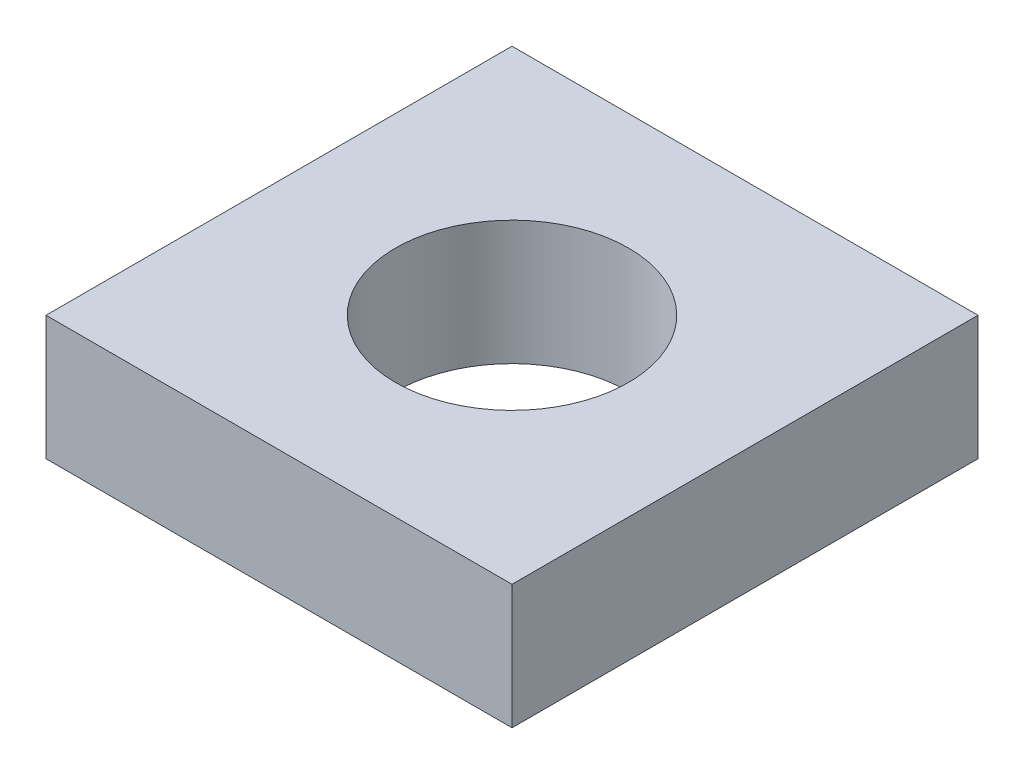
ISO-10303-21;
HEADER;
FILE_DESCRIPTION(('STEP AP214'),'2;1');
FILE_NAME('part.step','',(''),(''),'','','');
FILE_SCHEMA(('AUTOMOTIVE_DESIGN { 1 0 10303 214 1 1 1 1 }'));
ENDSEC;
DATA;
#1=APPLICATION_CONTEXT('core data for automotive mechanical design processes');
#2=APPLICATION_PROTOCOL_DEFINITION('international standard','automotive_design',2000,#1);
#3=PRODUCT_CONTEXT('',#1,'mechanical');
#4=PRODUCT('Part','Part','',(#3));
#5=PRODUCT_RELATED_PRODUCT_CATEGORY('part','',(#4));
#6=PRODUCT_DEFINITION_FORMATION('','',#4);
#7=PRODUCT_DEFINITION_CONTEXT('part definition',#1,'design');
#8=PRODUCT_DEFINITION('design','',#6,#7);
#9=PRODUCT_DEFINITION_SHAPE('','',#8);
#10=(LENGTH_UNIT() NAMED_UNIT(*) SI_UNIT(.MILLI.,.METRE.));
#11=(NAMED_UNIT(*) PLANE_ANGLE_UNIT() SI_UNIT($,.RADIAN.));
#12=(NAMED_UNIT(*) SI_UNIT($,.STERADIAN.) SOLID_ANGLE_UNIT());
#13=UNCERTAINTY_MEASURE_WITH_UNIT(LENGTH_MEASURE(1.E-05),#10,'distance_accuracy_value','');
#14=(GEOMETRIC_REPRESENTATION_CONTEXT(3) GLOBAL_UNCERTAINTY_ASSIGNED_CONTEXT((#13)) GLOBAL_UNIT_ASSIGNED_CONTEXT((#10,
#11,#12)) REPRESENTATION_CONTEXT('',''));
#15=CARTESIAN_POINT('',(0.,0.,0.));
#16=DIRECTION('',(0.,0.,1.));
#17=DIRECTION('',(1.,0.,0.));
#18=AXIS2_PLACEMENT_3D('',#15,#16,#17);
#19=CARTESIAN_POINT('',(0.,1.6,0.));
#20=DIRECTION('',(0.,1.,0.));
#21=DIRECTION('',(0.,0.,1.));
#22=AXIS2_PLACEMENT_3D('',#19,#20,#21);
#23=PLANE('',#22);
#24=DIRECTION('',(0.,0.,-1.));
#25=VECTOR('',#24,1.);
#26=CARTESIAN_POINT('',(3.,1.6,-3.));
#27=LINE('',#26,#25);
#28=CARTESIAN_POINT('',(3.,1.6,3.));
#29=VERTEX_POINT('',#28);
#30=CARTESIAN_POINT('',(3.,1.6,-3.));
#31=VERTEX_POINT('',#30);
#32=EDGE_CURVE('E85',#29,#31,#27,.T.);
#33=ORIENTED_EDGE('',*,*,#32,.T.);
#34=DIRECTION('',(-1.,0.,0.));
#35=VECTOR('',#34,1.);
#36=CARTESIAN_POINT('',(-3.,1.6,-3.));
#37=LINE('',#36,#35);
#38=CARTESIAN_POINT('',(-3.,1.6,-3.));
#39=VERTEX_POINT('',#38);
#40=EDGE_CURVE('E80',#31,#39,#37,.T.);
#41=ORIENTED_EDGE('',*,*,#40,.T.);
#42=DIRECTION('',(0.,0.,1.));
#43=VECTOR('',#42,1.);
#44=CARTESIAN_POINT('',(-3.,1.6,-3.));
#45=LINE('',#44,#43);
#46=CARTESIAN_POINT('',(-3.,1.6,3.));
#47=VERTEX_POINT('',#46);
#48=EDGE_CURVE('E83',#39,#47,#45,.T.);
#49=ORIENTED_EDGE('',*,*,#48,.T.);
#50=DIRECTION('',(1.,0.,0.));
#51=VECTOR('',#50,1.);
#52=CARTESIAN_POINT('',(-3.,1.6,3.));
#53=LINE('',#52,#51);
#54=EDGE_CURVE('E50',#47,#29,#53,.T.);
#55=ORIENTED_EDGE('',*,*,#54,.T.);
#56=EDGE_LOOP('',(#33,#41,#49,#55));
#57=FACE_BOUND('',#56,.T.);
#58=CARTESIAN_POINT('',(0.,1.6,0.));
#59=DIRECTION('',(0.,1.,0.));
#60=DIRECTION('',(0.,0.,1.));
#61=AXIS2_PLACEMENT_3D('',#58,#59,#60);
#62=CIRCLE('',#61,1.5);
#63=CARTESIAN_POINT('',(0.,1.6,1.5));
#64=VERTEX_POINT('',#63);
#65=EDGE_CURVE('E100',#64,#64,#62,.T.);
#66=ORIENTED_EDGE('',*,*,#65,.F.);
#67=EDGE_LOOP('',(#66));
#68=FACE_BOUND('',#67,.T.);
#69=ADVANCED_FACE('F33',(#57,#68),#23,.T.);
#70=CARTESIAN_POINT('',(0.,0.,0.));
#71=DIRECTION('',(0.,1.,0.));
#72=DIRECTION('',(0.,0.,1.));
#73=AXIS2_PLACEMENT_3D('',#70,#71,#72);
#74=PLANE('',#73);
#75=DIRECTION('',(0.,0.,-1.));
#76=VECTOR('',#75,1.);
#77=CARTESIAN_POINT('',(3.,0.,-3.));
#78=LINE('',#77,#76);
#79=CARTESIAN_POINT('',(3.,0.,3.));
#80=VERTEX_POINT('',#79);
#81=CARTESIAN_POINT('',(3.,0.,-3.));
#82=VERTEX_POINT('',#81);
#83=EDGE_CURVE('E97',#80,#82,#78,.T.);
#84=ORIENTED_EDGE('',*,*,#83,.F.);
#85=DIRECTION('',(1.,0.,0.));
#86=VECTOR('',#85,1.);
#87=CARTESIAN_POINT('',(-3.,0.,3.));
#88=LINE('',#87,#86);
#89=CARTESIAN_POINT('',(-3.,0.,3.));
#90=VERTEX_POINT('',#89);
#91=EDGE_CURVE('E73',#90,#80,#88,.T.);
#92=ORIENTED_EDGE('',*,*,#91,.F.);
#93=DIRECTION('',(0.,0.,1.));
#94=VECTOR('',#93,1.);
#95=CARTESIAN_POINT('',(-3.,0.,-3.));
#96=LINE('',#95,#94);
#97=CARTESIAN_POINT('',(-3.,0.,-3.));
#98=VERTEX_POINT('',#97);
#99=EDGE_CURVE('E67',#98,#90,#96,.T.);
#100=ORIENTED_EDGE('',*,*,#99,.F.);
#101=DIRECTION('',(-1.,0.,0.));
#102=VECTOR('',#101,1.);
#103=CARTESIAN_POINT('',(-3.,0.,-3.));
#104=LINE('',#103,#102);
#105=EDGE_CURVE('E89',#82,#98,#104,.T.);
#106=ORIENTED_EDGE('',*,*,#105,.F.);
#107=EDGE_LOOP('',(#84,#92,#100,#106));
#108=FACE_BOUND('',#107,.T.);
#109=CARTESIAN_POINT('',(0.,0.,0.));
#110=DIRECTION('',(0.,1.,0.));
#111=DIRECTION('',(0.,0.,1.));
#112=AXIS2_PLACEMENT_3D('',#109,#110,#111);
#113=CIRCLE('',#112,1.5);
#114=CARTESIAN_POINT('',(0.,0.,1.5));
#115=VERTEX_POINT('',#114);
#116=EDGE_CURVE('E112',#115,#115,#113,.T.);
#117=ORIENTED_EDGE('',*,*,#116,.T.);
#118=EDGE_LOOP('',(#117));
#119=FACE_BOUND('',#118,.T.);
#120=ADVANCED_FACE('F108',(#108,#119),#74,.F.);
#121=CARTESIAN_POINT('',(3.,1.6,-3.));
#122=DIRECTION('',(-1.,0.,0.));
#123=DIRECTION('',(0.,0.,1.));
#124=AXIS2_PLACEMENT_3D('',#121,#122,#123);
#125=PLANE('',#124);
#126=ORIENTED_EDGE('',*,*,#83,.T.);
#127=DIRECTION('',(0.,-1.,0.));
#128=VECTOR('',#127,1.);
#129=CARTESIAN_POINT('',(3.,1.6,-3.));
#130=LINE('',#129,#128);
#131=EDGE_CURVE('E11',#31,#82,#130,.T.);
#132=ORIENTED_EDGE('',*,*,#131,.F.);
#133=ORIENTED_EDGE('',*,*,#32,.F.);
#134=DIRECTION('',(0.,-1.,0.));
#135=VECTOR('',#134,1.);
#136=CARTESIAN_POINT('',(3.,1.6,3.));
#137=LINE('',#136,#135);
#138=EDGE_CURVE('E93',#29,#80,#137,.T.);
#139=ORIENTED_EDGE('',*,*,#138,.T.);
#140=EDGE_LOOP('',(#126,#132,#133,#139));
#141=FACE_BOUND('',#140,.T.);
#142=ADVANCED_FACE('F35',(#141),#125,.F.);
#143=CARTESIAN_POINT('',(-3.,1.6,-3.));
#144=DIRECTION('',(0.,0.,1.));
#145=DIRECTION('',(1.,0.,0.));
#146=AXIS2_PLACEMENT_3D('',#143,#144,#145);
#147=PLANE('',#146);
#148=ORIENTED_EDGE('',*,*,#105,.T.);
#149=DIRECTION('',(0.,-1.,0.));
#150=VECTOR('',#149,1.);
#151=CARTESIAN_POINT('',(-3.,1.6,-3.));
#152=LINE('',#151,#150);
#153=EDGE_CURVE('E42',#39,#98,#152,.T.);
#154=ORIENTED_EDGE('',*,*,#153,.F.);
#155=ORIENTED_EDGE('',*,*,#40,.F.);
#156=ORIENTED_EDGE('',*,*,#131,.T.);
#157=EDGE_LOOP('',(#148,#154,#155,#156));
#158=FACE_BOUND('',#157,.T.);
#159=ADVANCED_FACE('F88',(#158),#147,.F.);
#160=CARTESIAN_POINT('',(-3.,1.6,-3.));
#161=DIRECTION('',(1.,0.,0.));
#162=DIRECTION('',(0.,0.,-1.));
#163=AXIS2_PLACEMENT_3D('',#160,#161,#162);
#164=PLANE('',#163);
#165=ORIENTED_EDGE('',*,*,#99,.T.);
#166=DIRECTION('',(0.,-1.,0.));
#167=VECTOR('',#166,1.);
#168=CARTESIAN_POINT('',(-3.,1.6,3.));
#169=LINE('',#168,#167);
#170=EDGE_CURVE('E90',#47,#90,#169,.T.);
#171=ORIENTED_EDGE('',*,*,#170,.F.);
#172=ORIENTED_EDGE('',*,*,#48,.F.);
#173=ORIENTED_EDGE('',*,*,#153,.T.);
#174=EDGE_LOOP('',(#165,#171,#172,#173));
#175=FACE_BOUND('',#174,.T.);
#176=ADVANCED_FACE('F91',(#175),#164,.F.);
#177=CARTESIAN_POINT('',(-3.,1.6,3.));
#178=DIRECTION('',(0.,0.,-1.));
#179=DIRECTION('',(-1.,0.,0.));
#180=AXIS2_PLACEMENT_3D('',#177,#178,#179);
#181=PLANE('',#180);
#182=ORIENTED_EDGE('',*,*,#91,.T.);
#183=ORIENTED_EDGE('',*,*,#138,.F.);
#184=ORIENTED_EDGE('',*,*,#54,.F.);
#185=ORIENTED_EDGE('',*,*,#170,.T.);
#186=EDGE_LOOP('',(#182,#183,#184,#185));
#187=FACE_BOUND('',#186,.T.);
#188=ADVANCED_FACE('F105',(#187),#181,.F.);
#189=CARTESIAN_POINT('',(0.,1.6,0.));
#190=DIRECTION('',(0.,-1.,0.));
#191=DIRECTION('',(0.,0.,-1.));
#192=AXIS2_PLACEMENT_3D('',#189,#190,#191);
#193=CYLINDRICAL_SURFACE('',#192,1.5);
#194=ORIENTED_EDGE('',*,*,#65,.T.);
#195=EDGE_LOOP('',(#194));
#196=FACE_BOUND('',#195,.T.);
#197=ORIENTED_EDGE('',*,*,#116,.F.);
#198=EDGE_LOOP('',(#197));
#199=FACE_BOUND('',#198,.T.);
#200=ADVANCED_FACE('F118',(#196,#199),#193,.F.);
#201=CLOSED_SHELL('',(#69,#120,#142,#159,#176,#188,#200));
#202=MANIFOLD_SOLID_BREP('B2',#201);
#203=ADVANCED_BREP_SHAPE_REPRESENTATION('',(#18,#202),#14);
#204=SHAPE_DEFINITION_REPRESENTATION(#9,#203);
ENDSEC;
END-ISO-10303-21;
